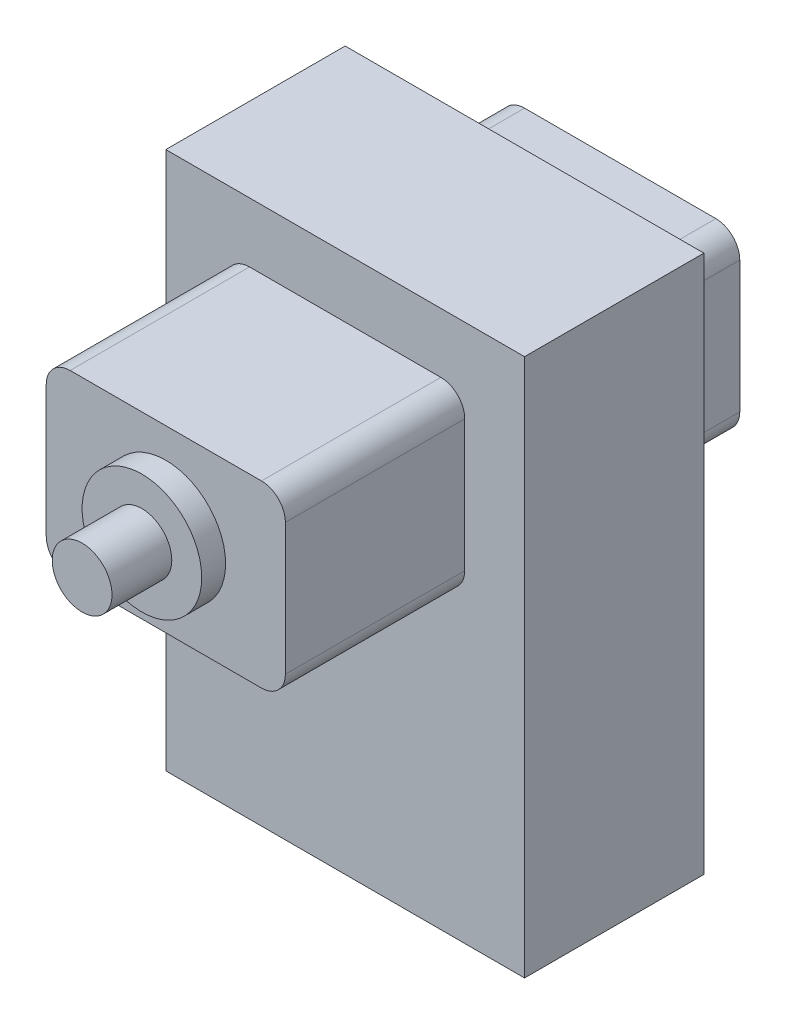
ISO-10303-21;
HEADER;
FILE_DESCRIPTION(('STEP AP214'),'2;1');
FILE_NAME('part.step','',(''),(''),'','','');
FILE_SCHEMA(('AUTOMOTIVE_DESIGN { 1 0 10303 214 1 1 1 1 }'));
ENDSEC;
DATA;
#1=APPLICATION_CONTEXT('core data for automotive mechanical design processes');
#2=APPLICATION_PROTOCOL_DEFINITION('international standard','automotive_design',2000,#1);
#3=PRODUCT_CONTEXT('',#1,'mechanical');
#4=PRODUCT('Part','Part','',(#3));
#5=PRODUCT_RELATED_PRODUCT_CATEGORY('part','',(#4));
#6=PRODUCT_DEFINITION_FORMATION('','',#4);
#7=PRODUCT_DEFINITION_CONTEXT('part definition',#1,'design');
#8=PRODUCT_DEFINITION('design','',#6,#7);
#9=PRODUCT_DEFINITION_SHAPE('','',#8);
#10=(LENGTH_UNIT() NAMED_UNIT(*) SI_UNIT(.MILLI.,.METRE.));
#11=(NAMED_UNIT(*) PLANE_ANGLE_UNIT() SI_UNIT($,.RADIAN.));
#12=(NAMED_UNIT(*) SI_UNIT($,.STERADIAN.) SOLID_ANGLE_UNIT());
#13=UNCERTAINTY_MEASURE_WITH_UNIT(LENGTH_MEASURE(1.E-05),#10,'distance_accuracy_value','');
#14=(GEOMETRIC_REPRESENTATION_CONTEXT(3) GLOBAL_UNCERTAINTY_ASSIGNED_CONTEXT((#13)) GLOBAL_UNIT_ASSIGNED_CONTEXT((#10,
#11,#12)) REPRESENTATION_CONTEXT('',''));
#15=CARTESIAN_POINT('',(0.,0.,0.));
#16=DIRECTION('',(0.,0.,1.));
#17=DIRECTION('',(1.,0.,0.));
#18=AXIS2_PLACEMENT_3D('',#15,#16,#17);
#19=CARTESIAN_POINT('',(0.,0.,0.));
#20=DIRECTION('',(0.,0.,1.));
#21=DIRECTION('',(1.,0.,0.));
#22=AXIS2_PLACEMENT_3D('',#19,#20,#21);
#23=PLANE('',#22);
#24=DIRECTION('',(0.,1.,0.));
#25=VECTOR('',#24,1.);
#26=CARTESIAN_POINT('',(0.,0.,0.));
#27=LINE('',#26,#25);
#28=CARTESIAN_POINT('',(0.,0.,0.));
#29=VERTEX_POINT('',#28);
#30=CARTESIAN_POINT('',(0.,45.,0.));
#31=VERTEX_POINT('',#30);
#32=EDGE_CURVE('E181',#29,#31,#27,.T.);
#33=ORIENTED_EDGE('',*,*,#32,.F.);
#34=DIRECTION('',(1.,0.,0.));
#35=VECTOR('',#34,1.);
#36=CARTESIAN_POINT('',(0.,0.,0.));
#37=LINE('',#36,#35);
#38=CARTESIAN_POINT('',(-30.,0.,0.));
#39=VERTEX_POINT('',#38);
#40=EDGE_CURVE('E177',#39,#29,#37,.T.);
#41=ORIENTED_EDGE('',*,*,#40,.F.);
#42=DIRECTION('',(0.,-1.,0.));
#43=VECTOR('',#42,1.);
#44=CARTESIAN_POINT('',(-30.,0.,0.));
#45=LINE('',#44,#43);
#46=CARTESIAN_POINT('',(-30.,45.,0.));
#47=VERTEX_POINT('',#46);
#48=EDGE_CURVE('E314',#47,#39,#45,.T.);
#49=ORIENTED_EDGE('',*,*,#48,.F.);
#50=DIRECTION('',(-1.,0.,0.));
#51=VECTOR('',#50,1.);
#52=CARTESIAN_POINT('',(0.,45.,0.));
#53=LINE('',#52,#51);
#54=EDGE_CURVE('E312',#31,#47,#53,.T.);
#55=ORIENTED_EDGE('',*,*,#54,.F.);
#56=EDGE_LOOP('',(#33,#41,#49,#55));
#57=FACE_BOUND('',#56,.T.);
#58=DIRECTION('',(0.,-1.,0.));
#59=VECTOR('',#58,1.);
#60=CARTESIAN_POINT('',(-5.,40.,0.));
#61=LINE('',#60,#59);
#62=CARTESIAN_POINT('',(-5.,38.,0.));
#63=VERTEX_POINT('',#62);
#64=CARTESIAN_POINT('',(-5.,27.,0.));
#65=VERTEX_POINT('',#64);
#66=EDGE_CURVE('E276',#63,#65,#61,.T.);
#67=ORIENTED_EDGE('',*,*,#66,.F.);
#68=CARTESIAN_POINT('',(-7.,38.,0.));
#69=DIRECTION('',(0.,0.,1.));
#70=DIRECTION('',(1.,0.,0.));
#71=AXIS2_PLACEMENT_3D('',#68,#69,#70);
#72=CIRCLE('',#71,2.);
#73=CARTESIAN_POINT('',(-7.,40.,0.));
#74=VERTEX_POINT('',#73);
#75=EDGE_CURVE('E21',#63,#74,#72,.T.);
#76=ORIENTED_EDGE('',*,*,#75,.T.);
#77=DIRECTION('',(1.,0.,0.));
#78=VECTOR('',#77,1.);
#79=CARTESIAN_POINT('',(-5.,40.,0.));
#80=LINE('',#79,#78);
#81=CARTESIAN_POINT('',(-23.,40.,0.));
#82=VERTEX_POINT('',#81);
#83=EDGE_CURVE('E266',#82,#74,#80,.T.);
#84=ORIENTED_EDGE('',*,*,#83,.F.);
#85=CARTESIAN_POINT('',(-23.,38.,0.));
#86=DIRECTION('',(0.,0.,1.));
#87=DIRECTION('',(1.,0.,0.));
#88=AXIS2_PLACEMENT_3D('',#85,#86,#87);
#89=CIRCLE('',#88,2.);
#90=CARTESIAN_POINT('',(-25.,38.,0.));
#91=VERTEX_POINT('',#90);
#92=EDGE_CURVE('E250',#82,#91,#89,.T.);
#93=ORIENTED_EDGE('',*,*,#92,.T.);
#94=DIRECTION('',(0.,1.,0.));
#95=VECTOR('',#94,1.);
#96=CARTESIAN_POINT('',(-25.,40.,0.));
#97=LINE('',#96,#95);
#98=CARTESIAN_POINT('',(-25.,27.,0.));
#99=VERTEX_POINT('',#98);
#100=EDGE_CURVE('E281',#99,#91,#97,.T.);
#101=ORIENTED_EDGE('',*,*,#100,.F.);
#102=CARTESIAN_POINT('',(-23.,27.,0.));
#103=DIRECTION('',(0.,0.,1.));
#104=DIRECTION('',(1.,0.,0.));
#105=AXIS2_PLACEMENT_3D('',#102,#103,#104);
#106=CIRCLE('',#105,2.);
#107=CARTESIAN_POINT('',(-23.,25.,0.));
#108=VERTEX_POINT('',#107);
#109=EDGE_CURVE('E252',#99,#108,#106,.T.);
#110=ORIENTED_EDGE('',*,*,#109,.T.);
#111=DIRECTION('',(-1.,0.,0.));
#112=VECTOR('',#111,1.);
#113=CARTESIAN_POINT('',(-5.,25.,0.));
#114=LINE('',#113,#112);
#115=CARTESIAN_POINT('',(-7.,25.,0.));
#116=VERTEX_POINT('',#115);
#117=EDGE_CURVE('E278',#116,#108,#114,.T.);
#118=ORIENTED_EDGE('',*,*,#117,.F.);
#119=CARTESIAN_POINT('',(-7.,27.,0.));
#120=DIRECTION('',(0.,0.,1.));
#121=DIRECTION('',(1.,0.,0.));
#122=AXIS2_PLACEMENT_3D('',#119,#120,#121);
#123=CIRCLE('',#122,2.);
#124=EDGE_CURVE('E34',#116,#65,#123,.T.);
#125=ORIENTED_EDGE('',*,*,#124,.T.);
#126=EDGE_LOOP('',(#67,#76,#84,#93,#101,#110,#118,#125));
#127=FACE_BOUND('',#126,.T.);
#128=ADVANCED_FACE('F17',(#57,#127),#23,.F.);
#129=CARTESIAN_POINT('',(0.,0.,15.));
#130=DIRECTION('',(-1.,0.,0.));
#131=DIRECTION('',(0.,0.,1.));
#132=AXIS2_PLACEMENT_3D('',#129,#130,#131);
#133=PLANE('',#132);
#134=ORIENTED_EDGE('',*,*,#32,.T.);
#135=DIRECTION('',(0.,0.,-1.));
#136=VECTOR('',#135,1.);
#137=CARTESIAN_POINT('',(0.,45.,15.));
#138=LINE('',#137,#136);
#139=CARTESIAN_POINT('',(0.,45.,15.));
#140=VERTEX_POINT('',#139);
#141=EDGE_CURVE('E161',#140,#31,#138,.T.);
#142=ORIENTED_EDGE('',*,*,#141,.F.);
#143=DIRECTION('',(0.,1.,0.));
#144=VECTOR('',#143,1.);
#145=CARTESIAN_POINT('',(0.,0.,15.));
#146=LINE('',#145,#144);
#147=CARTESIAN_POINT('',(0.,0.,15.));
#148=VERTEX_POINT('',#147);
#149=EDGE_CURVE('E168',#148,#140,#146,.T.);
#150=ORIENTED_EDGE('',*,*,#149,.F.);
#151=DIRECTION('',(0.,0.,-1.));
#152=VECTOR('',#151,1.);
#153=CARTESIAN_POINT('',(0.,0.,15.));
#154=LINE('',#153,#152);
#155=EDGE_CURVE('E310',#148,#29,#154,.T.);
#156=ORIENTED_EDGE('',*,*,#155,.T.);
#157=EDGE_LOOP('',(#134,#142,#150,#156));
#158=FACE_BOUND('',#157,.T.);
#159=ADVANCED_FACE('F179',(#158),#133,.F.);
#160=CARTESIAN_POINT('',(0.,45.,15.));
#161=DIRECTION('',(0.,-1.,0.));
#162=DIRECTION('',(0.,0.,-1.));
#163=AXIS2_PLACEMENT_3D('',#160,#161,#162);
#164=PLANE('',#163);
#165=ORIENTED_EDGE('',*,*,#54,.T.);
#166=DIRECTION('',(0.,0.,-1.));
#167=VECTOR('',#166,1.);
#168=CARTESIAN_POINT('',(-30.,45.,15.));
#169=LINE('',#168,#167);
#170=CARTESIAN_POINT('',(-30.,45.,15.));
#171=VERTEX_POINT('',#170);
#172=EDGE_CURVE('E164',#171,#47,#169,.T.);
#173=ORIENTED_EDGE('',*,*,#172,.F.);
#174=DIRECTION('',(-1.,0.,0.));
#175=VECTOR('',#174,1.);
#176=CARTESIAN_POINT('',(0.,45.,15.));
#177=LINE('',#176,#175);
#178=EDGE_CURVE('E157',#140,#171,#177,.T.);
#179=ORIENTED_EDGE('',*,*,#178,.F.);
#180=ORIENTED_EDGE('',*,*,#141,.T.);
#181=EDGE_LOOP('',(#165,#173,#179,#180));
#182=FACE_BOUND('',#181,.T.);
#183=ADVANCED_FACE('F159',(#182),#164,.F.);
#184=CARTESIAN_POINT('',(-30.,0.,15.));
#185=DIRECTION('',(1.,0.,0.));
#186=DIRECTION('',(0.,0.,-1.));
#187=AXIS2_PLACEMENT_3D('',#184,#185,#186);
#188=PLANE('',#187);
#189=ORIENTED_EDGE('',*,*,#48,.T.);
#190=DIRECTION('',(0.,0.,-1.));
#191=VECTOR('',#190,1.);
#192=CARTESIAN_POINT('',(-30.,0.,15.));
#193=LINE('',#192,#191);
#194=CARTESIAN_POINT('',(-30.,0.,15.));
#195=VERTEX_POINT('',#194);
#196=EDGE_CURVE('E186',#195,#39,#193,.T.);
#197=ORIENTED_EDGE('',*,*,#196,.F.);
#198=DIRECTION('',(0.,-1.,0.));
#199=VECTOR('',#198,1.);
#200=CARTESIAN_POINT('',(-30.,0.,15.));
#201=LINE('',#200,#199);
#202=EDGE_CURVE('E167',#171,#195,#201,.T.);
#203=ORIENTED_EDGE('',*,*,#202,.F.);
#204=ORIENTED_EDGE('',*,*,#172,.T.);
#205=EDGE_LOOP('',(#189,#197,#203,#204));
#206=FACE_BOUND('',#205,.T.);
#207=ADVANCED_FACE('F325',(#206),#188,.F.);
#208=CARTESIAN_POINT('',(0.,0.,15.));
#209=DIRECTION('',(0.,1.,0.));
#210=DIRECTION('',(-1.,0.,0.));
#211=AXIS2_PLACEMENT_3D('',#208,#209,#210);
#212=PLANE('',#211);
#213=ORIENTED_EDGE('',*,*,#40,.T.);
#214=ORIENTED_EDGE('',*,*,#155,.F.);
#215=DIRECTION('',(1.,0.,0.));
#216=VECTOR('',#215,1.);
#217=CARTESIAN_POINT('',(0.,0.,15.));
#218=LINE('',#217,#216);
#219=EDGE_CURVE('E173',#195,#148,#218,.T.);
#220=ORIENTED_EDGE('',*,*,#219,.F.);
#221=ORIENTED_EDGE('',*,*,#196,.T.);
#222=EDGE_LOOP('',(#213,#214,#220,#221));
#223=FACE_BOUND('',#222,.T.);
#224=ADVANCED_FACE('F321',(#223),#212,.F.);
#225=CARTESIAN_POINT('',(0.,0.,15.));
#226=DIRECTION('',(0.,0.,1.));
#227=DIRECTION('',(1.,0.,0.));
#228=AXIS2_PLACEMENT_3D('',#225,#226,#227);
#229=PLANE('',#228);
#230=DIRECTION('',(0.,-1.,0.));
#231=VECTOR('',#230,1.);
#232=CARTESIAN_POINT('',(-25.,40.,15.));
#233=LINE('',#232,#231);
#234=CARTESIAN_POINT('',(-25.,38.,15.));
#235=VERTEX_POINT('',#234);
#236=CARTESIAN_POINT('',(-25.,27.,15.));
#237=VERTEX_POINT('',#236);
#238=EDGE_CURVE('E275',#235,#237,#233,.T.);
#239=ORIENTED_EDGE('',*,*,#238,.F.);
#240=CARTESIAN_POINT('',(-23.,38.,15.));
#241=DIRECTION('',(0.,0.,1.));
#242=DIRECTION('',(1.,0.,0.));
#243=AXIS2_PLACEMENT_3D('',#240,#241,#242);
#244=CIRCLE('',#243,2.);
#245=CARTESIAN_POINT('',(-23.,40.,15.));
#246=VERTEX_POINT('',#245);
#247=EDGE_CURVE('E248',#235,#246,#244,.F.);
#248=ORIENTED_EDGE('',*,*,#247,.T.);
#249=DIRECTION('',(-1.,0.,0.));
#250=VECTOR('',#249,1.);
#251=CARTESIAN_POINT('',(-25.,40.,15.));
#252=LINE('',#251,#250);
#253=CARTESIAN_POINT('',(-7.,40.,15.));
#254=VERTEX_POINT('',#253);
#255=EDGE_CURVE('E289',#254,#246,#252,.T.);
#256=ORIENTED_EDGE('',*,*,#255,.F.);
#257=CARTESIAN_POINT('',(-7.,38.,15.));
#258=DIRECTION('',(0.,0.,1.));
#259=DIRECTION('',(1.,0.,0.));
#260=AXIS2_PLACEMENT_3D('',#257,#258,#259);
#261=CIRCLE('',#260,2.);
#262=CARTESIAN_POINT('',(-5.,38.,15.));
#263=VERTEX_POINT('',#262);
#264=EDGE_CURVE('E246',#254,#263,#261,.F.);
#265=ORIENTED_EDGE('',*,*,#264,.T.);
#266=DIRECTION('',(0.,1.,0.));
#267=VECTOR('',#266,1.);
#268=CARTESIAN_POINT('',(-5.,40.,15.));
#269=LINE('',#268,#267);
#270=CARTESIAN_POINT('',(-5.,27.,15.));
#271=VERTEX_POINT('',#270);
#272=EDGE_CURVE('E303',#271,#263,#269,.T.);
#273=ORIENTED_EDGE('',*,*,#272,.F.);
#274=CARTESIAN_POINT('',(-7.,27.,15.));
#275=DIRECTION('',(0.,0.,1.));
#276=DIRECTION('',(1.,0.,0.));
#277=AXIS2_PLACEMENT_3D('',#274,#275,#276);
#278=CIRCLE('',#277,2.);
#279=CARTESIAN_POINT('',(-7.,25.,15.));
#280=VERTEX_POINT('',#279);
#281=EDGE_CURVE('E244',#271,#280,#278,.F.);
#282=ORIENTED_EDGE('',*,*,#281,.T.);
#283=DIRECTION('',(1.,0.,0.));
#284=VECTOR('',#283,1.);
#285=CARTESIAN_POINT('',(-25.,25.,15.));
#286=LINE('',#285,#284);
#287=CARTESIAN_POINT('',(-23.,25.,15.));
#288=VERTEX_POINT('',#287);
#289=EDGE_CURVE('E300',#288,#280,#286,.T.);
#290=ORIENTED_EDGE('',*,*,#289,.F.);
#291=CARTESIAN_POINT('',(-23.,27.,15.));
#292=DIRECTION('',(0.,0.,1.));
#293=DIRECTION('',(1.,0.,0.));
#294=AXIS2_PLACEMENT_3D('',#291,#292,#293);
#295=CIRCLE('',#294,2.);
#296=EDGE_CURVE('E242',#288,#237,#295,.F.);
#297=ORIENTED_EDGE('',*,*,#296,.T.);
#298=EDGE_LOOP('',(#239,#248,#256,#265,#273,#282,#290,#297));
#299=FACE_BOUND('',#298,.T.);
#300=ORIENTED_EDGE('',*,*,#149,.T.);
#301=ORIENTED_EDGE('',*,*,#178,.T.);
#302=ORIENTED_EDGE('',*,*,#202,.T.);
#303=ORIENTED_EDGE('',*,*,#219,.T.);
#304=EDGE_LOOP('',(#300,#301,#302,#303));
#305=FACE_BOUND('',#304,.T.);
#306=ADVANCED_FACE('F171',(#299,#305),#229,.T.);
#307=CARTESIAN_POINT('',(-25.,40.,30.));
#308=DIRECTION('',(1.,0.,0.));
#309=DIRECTION('',(0.,0.,-1.));
#310=AXIS2_PLACEMENT_3D('',#307,#308,#309);
#311=PLANE('',#310);
#312=ORIENTED_EDGE('',*,*,#238,.T.);
#313=DIRECTION('',(0.,0.,-1.));
#314=VECTOR('',#313,1.);
#315=CARTESIAN_POINT('',(-25.,27.,30.));
#316=LINE('',#315,#314);
#317=CARTESIAN_POINT('',(-25.,27.,30.));
#318=VERTEX_POINT('',#317);
#319=EDGE_CURVE('E195',#237,#318,#316,.F.);
#320=ORIENTED_EDGE('',*,*,#319,.T.);
#321=DIRECTION('',(0.,-1.,0.));
#322=VECTOR('',#321,1.);
#323=CARTESIAN_POINT('',(-25.,40.,30.));
#324=LINE('',#323,#322);
#325=CARTESIAN_POINT('',(-25.,38.,30.));
#326=VERTEX_POINT('',#325);
#327=EDGE_CURVE('E285',#326,#318,#324,.T.);
#328=ORIENTED_EDGE('',*,*,#327,.F.);
#329=DIRECTION('',(0.,0.,-1.));
#330=VECTOR('',#329,1.);
#331=CARTESIAN_POINT('',(-25.,38.,30.));
#332=LINE('',#331,#330);
#333=EDGE_CURVE('E192',#326,#235,#332,.T.);
#334=ORIENTED_EDGE('',*,*,#333,.T.);
#335=EDGE_LOOP('',(#312,#320,#328,#334));
#336=FACE_BOUND('',#335,.T.);
#337=ADVANCED_FACE('F345',(#336),#311,.F.);
#338=CARTESIAN_POINT('',(-25.,25.,30.));
#339=DIRECTION('',(0.,1.,0.));
#340=DIRECTION('',(0.,0.,1.));
#341=AXIS2_PLACEMENT_3D('',#338,#339,#340);
#342=PLANE('',#341);
#343=DIRECTION('',(1.,0.,0.));
#344=VECTOR('',#343,1.);
#345=CARTESIAN_POINT('',(-25.,25.,30.));
#346=LINE('',#345,#344);
#347=CARTESIAN_POINT('',(-23.,25.,30.));
#348=VERTEX_POINT('',#347);
#349=CARTESIAN_POINT('',(-7.,25.,30.));
#350=VERTEX_POINT('',#349);
#351=EDGE_CURVE('E288',#348,#350,#346,.T.);
#352=ORIENTED_EDGE('',*,*,#351,.F.);
#353=DIRECTION('',(0.,0.,-1.));
#354=VECTOR('',#353,1.);
#355=CARTESIAN_POINT('',(-23.,25.,30.));
#356=LINE('',#355,#354);
#357=EDGE_CURVE('E184',#348,#288,#356,.T.);
#358=ORIENTED_EDGE('',*,*,#357,.T.);
#359=ORIENTED_EDGE('',*,*,#289,.T.);
#360=DIRECTION('',(0.,0.,-1.));
#361=VECTOR('',#360,1.);
#362=CARTESIAN_POINT('',(-7.,25.,30.));
#363=LINE('',#362,#361);
#364=EDGE_CURVE('E182',#280,#350,#363,.F.);
#365=ORIENTED_EDGE('',*,*,#364,.T.);
#366=EDGE_LOOP('',(#352,#358,#359,#365));
#367=FACE_BOUND('',#366,.T.);
#368=ADVANCED_FACE('F349',(#367),#342,.F.);
#369=CARTESIAN_POINT('',(-5.,40.,30.));
#370=DIRECTION('',(-1.,0.,0.));
#371=DIRECTION('',(0.,0.,1.));
#372=AXIS2_PLACEMENT_3D('',#369,#370,#371);
#373=PLANE('',#372);
#374=DIRECTION('',(0.,1.,0.));
#375=VECTOR('',#374,1.);
#376=CARTESIAN_POINT('',(-5.,40.,30.));
#377=LINE('',#376,#375);
#378=CARTESIAN_POINT('',(-5.,27.,30.));
#379=VERTEX_POINT('',#378);
#380=CARTESIAN_POINT('',(-5.,38.,30.));
#381=VERTEX_POINT('',#380);
#382=EDGE_CURVE('E292',#379,#381,#377,.T.);
#383=ORIENTED_EDGE('',*,*,#382,.F.);
#384=DIRECTION('',(0.,0.,-1.));
#385=VECTOR('',#384,1.);
#386=CARTESIAN_POINT('',(-5.,27.,30.));
#387=LINE('',#386,#385);
#388=EDGE_CURVE('E207',#379,#271,#387,.T.);
#389=ORIENTED_EDGE('',*,*,#388,.T.);
#390=ORIENTED_EDGE('',*,*,#272,.T.);
#391=DIRECTION('',(0.,0.,-1.));
#392=VECTOR('',#391,1.);
#393=CARTESIAN_POINT('',(-5.,38.,30.));
#394=LINE('',#393,#392);
#395=EDGE_CURVE('E205',#263,#381,#394,.F.);
#396=ORIENTED_EDGE('',*,*,#395,.T.);
#397=EDGE_LOOP('',(#383,#389,#390,#396));
#398=FACE_BOUND('',#397,.T.);
#399=ADVANCED_FACE('F353',(#398),#373,.F.);
#400=CARTESIAN_POINT('',(-25.,40.,30.));
#401=DIRECTION('',(0.,-1.,0.));
#402=DIRECTION('',(0.,0.,-1.));
#403=AXIS2_PLACEMENT_3D('',#400,#401,#402);
#404=PLANE('',#403);
#405=DIRECTION('',(-1.,0.,0.));
#406=VECTOR('',#405,1.);
#407=CARTESIAN_POINT('',(-25.,40.,30.));
#408=LINE('',#407,#406);
#409=CARTESIAN_POINT('',(-7.,40.,30.));
#410=VERTEX_POINT('',#409);
#411=CARTESIAN_POINT('',(-23.,40.,30.));
#412=VERTEX_POINT('',#411);
#413=EDGE_CURVE('E295',#410,#412,#408,.T.);
#414=ORIENTED_EDGE('',*,*,#413,.F.);
#415=DIRECTION('',(0.,0.,-1.));
#416=VECTOR('',#415,1.);
#417=CARTESIAN_POINT('',(-7.,40.,30.));
#418=LINE('',#417,#416);
#419=EDGE_CURVE('E212',#410,#254,#418,.T.);
#420=ORIENTED_EDGE('',*,*,#419,.T.);
#421=ORIENTED_EDGE('',*,*,#255,.T.);
#422=DIRECTION('',(0.,0.,-1.));
#423=VECTOR('',#422,1.);
#424=CARTESIAN_POINT('',(-23.,40.,30.));
#425=LINE('',#424,#423);
#426=EDGE_CURVE('E210',#246,#412,#425,.F.);
#427=ORIENTED_EDGE('',*,*,#426,.T.);
#428=EDGE_LOOP('',(#414,#420,#421,#427));
#429=FACE_BOUND('',#428,.T.);
#430=ADVANCED_FACE('F357',(#429),#404,.F.);
#431=CARTESIAN_POINT('',(0.,0.,30.));
#432=DIRECTION('',(0.,0.,1.));
#433=DIRECTION('',(1.,0.,0.));
#434=AXIS2_PLACEMENT_3D('',#431,#432,#433);
#435=PLANE('',#434);
#436=CARTESIAN_POINT('',(-15.,32.5,30.));
#437=DIRECTION('',(0.,0.,1.));
#438=DIRECTION('',(1.,0.,0.));
#439=AXIS2_PLACEMENT_3D('',#436,#437,#438);
#440=CIRCLE('',#439,5.);
#441=CARTESIAN_POINT('',(-10.,32.5,30.));
#442=VERTEX_POINT('',#441);
#443=EDGE_CURVE('E26',#442,#442,#440,.T.);
#444=ORIENTED_EDGE('',*,*,#443,.F.);
#445=EDGE_LOOP('',(#444));
#446=FACE_BOUND('',#445,.T.);
#447=ORIENTED_EDGE('',*,*,#327,.T.);
#448=CARTESIAN_POINT('',(-23.,27.,30.));
#449=DIRECTION('',(0.,0.,1.));
#450=DIRECTION('',(1.,0.,0.));
#451=AXIS2_PLACEMENT_3D('',#448,#449,#450);
#452=CIRCLE('',#451,2.);
#453=EDGE_CURVE('E203',#318,#348,#452,.T.);
#454=ORIENTED_EDGE('',*,*,#453,.T.);
#455=ORIENTED_EDGE('',*,*,#351,.T.);
#456=CARTESIAN_POINT('',(-7.,27.,30.));
#457=DIRECTION('',(0.,0.,1.));
#458=DIRECTION('',(1.,0.,0.));
#459=AXIS2_PLACEMENT_3D('',#456,#457,#458);
#460=CIRCLE('',#459,2.);
#461=EDGE_CURVE('E201',#350,#379,#460,.T.);
#462=ORIENTED_EDGE('',*,*,#461,.T.);
#463=ORIENTED_EDGE('',*,*,#382,.T.);
#464=CARTESIAN_POINT('',(-7.,38.,30.));
#465=DIRECTION('',(0.,0.,1.));
#466=DIRECTION('',(1.,0.,0.));
#467=AXIS2_PLACEMENT_3D('',#464,#465,#466);
#468=CIRCLE('',#467,2.);
#469=EDGE_CURVE('E199',#381,#410,#468,.T.);
#470=ORIENTED_EDGE('',*,*,#469,.T.);
#471=ORIENTED_EDGE('',*,*,#413,.T.);
#472=CARTESIAN_POINT('',(-23.,38.,30.));
#473=DIRECTION('',(0.,0.,1.));
#474=DIRECTION('',(1.,0.,0.));
#475=AXIS2_PLACEMENT_3D('',#472,#473,#474);
#476=CIRCLE('',#475,2.);
#477=EDGE_CURVE('E197',#412,#326,#476,.T.);
#478=ORIENTED_EDGE('',*,*,#477,.T.);
#479=EDGE_LOOP('',(#447,#454,#455,#462,#463,#470,#471,#478));
#480=FACE_BOUND('',#479,.T.);
#481=ADVANCED_FACE('F361',(#446,#480),#435,.T.);
#482=CARTESIAN_POINT('',(-5.,40.,-8.));
#483=DIRECTION('',(-1.,0.,0.));
#484=DIRECTION('',(0.,-1.,0.));
#485=AXIS2_PLACEMENT_3D('',#482,#483,#484);
#486=PLANE('',#485);
#487=ORIENTED_EDGE('',*,*,#66,.T.);
#488=DIRECTION('',(0.,0.,1.));
#489=VECTOR('',#488,1.);
#490=CARTESIAN_POINT('',(-5.,27.,-8.));
#491=LINE('',#490,#489);
#492=CARTESIAN_POINT('',(-5.,27.,-8.));
#493=VERTEX_POINT('',#492);
#494=EDGE_CURVE('E240',#65,#493,#491,.F.);
#495=ORIENTED_EDGE('',*,*,#494,.T.);
#496=DIRECTION('',(0.,-1.,0.));
#497=VECTOR('',#496,1.);
#498=CARTESIAN_POINT('',(-5.,40.,-8.));
#499=LINE('',#498,#497);
#500=CARTESIAN_POINT('',(-5.,38.,-8.));
#501=VERTEX_POINT('',#500);
#502=EDGE_CURVE('E262',#501,#493,#499,.T.);
#503=ORIENTED_EDGE('',*,*,#502,.F.);
#504=DIRECTION('',(0.,0.,1.));
#505=VECTOR('',#504,1.);
#506=CARTESIAN_POINT('',(-5.,38.,-8.));
#507=LINE('',#506,#505);
#508=EDGE_CURVE('E238',#501,#63,#507,.T.);
#509=ORIENTED_EDGE('',*,*,#508,.T.);
#510=EDGE_LOOP('',(#487,#495,#503,#509));
#511=FACE_BOUND('',#510,.T.);
#512=ADVANCED_FACE('F365',(#511),#486,.F.);
#513=CARTESIAN_POINT('',(-5.,25.,-8.));
#514=DIRECTION('',(0.,1.,0.));
#515=DIRECTION('',(0.,0.,1.));
#516=AXIS2_PLACEMENT_3D('',#513,#514,#515);
#517=PLANE('',#516);
#518=ORIENTED_EDGE('',*,*,#117,.T.);
#519=DIRECTION('',(0.,0.,1.));
#520=VECTOR('',#519,1.);
#521=CARTESIAN_POINT('',(-23.,25.,-8.));
#522=LINE('',#521,#520);
#523=CARTESIAN_POINT('',(-23.,25.,-8.));
#524=VERTEX_POINT('',#523);
#525=EDGE_CURVE('E236',#108,#524,#522,.F.);
#526=ORIENTED_EDGE('',*,*,#525,.T.);
#527=DIRECTION('',(-1.,0.,0.));
#528=VECTOR('',#527,1.);
#529=CARTESIAN_POINT('',(-5.,25.,-8.));
#530=LINE('',#529,#528);
#531=CARTESIAN_POINT('',(-7.,25.,-8.));
#532=VERTEX_POINT('',#531);
#533=EDGE_CURVE('E265',#532,#524,#530,.T.);
#534=ORIENTED_EDGE('',*,*,#533,.F.);
#535=DIRECTION('',(0.,0.,1.));
#536=VECTOR('',#535,1.);
#537=CARTESIAN_POINT('',(-7.,25.,-8.));
#538=LINE('',#537,#536);
#539=EDGE_CURVE('E233',#532,#116,#538,.T.);
#540=ORIENTED_EDGE('',*,*,#539,.T.);
#541=EDGE_LOOP('',(#518,#526,#534,#540));
#542=FACE_BOUND('',#541,.T.);
#543=ADVANCED_FACE('F369',(#542),#517,.F.);
#544=CARTESIAN_POINT('',(-25.,40.,-8.));
#545=DIRECTION('',(1.,0.,0.));
#546=DIRECTION('',(0.,1.,0.));
#547=AXIS2_PLACEMENT_3D('',#544,#545,#546);
#548=PLANE('',#547);
#549=ORIENTED_EDGE('',*,*,#100,.T.);
#550=DIRECTION('',(0.,0.,1.));
#551=VECTOR('',#550,1.);
#552=CARTESIAN_POINT('',(-25.,38.,-8.));
#553=LINE('',#552,#551);
#554=CARTESIAN_POINT('',(-25.,38.,-8.));
#555=VERTEX_POINT('',#554);
#556=EDGE_CURVE('E223',#91,#555,#553,.F.);
#557=ORIENTED_EDGE('',*,*,#556,.T.);
#558=DIRECTION('',(0.,1.,0.));
#559=VECTOR('',#558,1.);
#560=CARTESIAN_POINT('',(-25.,40.,-8.));
#561=LINE('',#560,#559);
#562=CARTESIAN_POINT('',(-25.,27.,-8.));
#563=VERTEX_POINT('',#562);
#564=EDGE_CURVE('E269',#563,#555,#561,.T.);
#565=ORIENTED_EDGE('',*,*,#564,.F.);
#566=DIRECTION('',(0.,0.,1.));
#567=VECTOR('',#566,1.);
#568=CARTESIAN_POINT('',(-25.,27.,-8.));
#569=LINE('',#568,#567);
#570=EDGE_CURVE('E220',#563,#99,#569,.T.);
#571=ORIENTED_EDGE('',*,*,#570,.T.);
#572=EDGE_LOOP('',(#549,#557,#565,#571));
#573=FACE_BOUND('',#572,.T.);
#574=ADVANCED_FACE('F373',(#573),#548,.F.);
#575=CARTESIAN_POINT('',(-5.,40.,-8.));
#576=DIRECTION('',(0.,-1.,0.));
#577=DIRECTION('',(0.,0.,-1.));
#578=AXIS2_PLACEMENT_3D('',#575,#576,#577);
#579=PLANE('',#578);
#580=DIRECTION('',(1.,0.,0.));
#581=VECTOR('',#580,1.);
#582=CARTESIAN_POINT('',(-5.,40.,-8.));
#583=LINE('',#582,#581);
#584=CARTESIAN_POINT('',(-23.,40.,-8.));
#585=VERTEX_POINT('',#584);
#586=CARTESIAN_POINT('',(-7.,40.,-8.));
#587=VERTEX_POINT('',#586);
#588=EDGE_CURVE('E272',#585,#587,#583,.T.);
#589=ORIENTED_EDGE('',*,*,#588,.F.);
#590=DIRECTION('',(0.,0.,1.));
#591=VECTOR('',#590,1.);
#592=CARTESIAN_POINT('',(-23.,40.,-8.));
#593=LINE('',#592,#591);
#594=EDGE_CURVE('E217',#585,#82,#593,.T.);
#595=ORIENTED_EDGE('',*,*,#594,.T.);
#596=ORIENTED_EDGE('',*,*,#83,.T.);
#597=DIRECTION('',(0.,0.,1.));
#598=VECTOR('',#597,1.);
#599=CARTESIAN_POINT('',(-7.,40.,-8.));
#600=LINE('',#599,#598);
#601=EDGE_CURVE('E215',#74,#587,#600,.F.);
#602=ORIENTED_EDGE('',*,*,#601,.T.);
#603=EDGE_LOOP('',(#589,#595,#596,#602));
#604=FACE_BOUND('',#603,.T.);
#605=ADVANCED_FACE('F377',(#604),#579,.F.);
#606=CARTESIAN_POINT('',(0.,0.,-8.));
#607=DIRECTION('',(0.,0.,-1.));
#608=DIRECTION('',(-1.,0.,0.));
#609=AXIS2_PLACEMENT_3D('',#606,#607,#608);
#610=PLANE('',#609);
#611=ORIENTED_EDGE('',*,*,#564,.T.);
#612=CARTESIAN_POINT('',(-23.,38.,-8.));
#613=DIRECTION('',(0.,0.,-1.));
#614=DIRECTION('',(-1.,0.,0.));
#615=AXIS2_PLACEMENT_3D('',#612,#613,#614);
#616=CIRCLE('',#615,2.);
#617=EDGE_CURVE('E231',#555,#585,#616,.T.);
#618=ORIENTED_EDGE('',*,*,#617,.T.);
#619=ORIENTED_EDGE('',*,*,#588,.T.);
#620=CARTESIAN_POINT('',(-7.,38.,-8.));
#621=DIRECTION('',(0.,0.,-1.));
#622=DIRECTION('',(-1.,0.,0.));
#623=AXIS2_PLACEMENT_3D('',#620,#621,#622);
#624=CIRCLE('',#623,2.);
#625=EDGE_CURVE('E225',#587,#501,#624,.T.);
#626=ORIENTED_EDGE('',*,*,#625,.T.);
#627=ORIENTED_EDGE('',*,*,#502,.T.);
#628=CARTESIAN_POINT('',(-7.,27.,-8.));
#629=DIRECTION('',(0.,0.,-1.));
#630=DIRECTION('',(-1.,0.,0.));
#631=AXIS2_PLACEMENT_3D('',#628,#629,#630);
#632=CIRCLE('',#631,2.);
#633=EDGE_CURVE('E227',#493,#532,#632,.T.);
#634=ORIENTED_EDGE('',*,*,#633,.T.);
#635=ORIENTED_EDGE('',*,*,#533,.T.);
#636=CARTESIAN_POINT('',(-23.,27.,-8.));
#637=DIRECTION('',(0.,0.,-1.));
#638=DIRECTION('',(-1.,0.,0.));
#639=AXIS2_PLACEMENT_3D('',#636,#637,#638);
#640=CIRCLE('',#639,2.);
#641=EDGE_CURVE('E229',#524,#563,#640,.T.);
#642=ORIENTED_EDGE('',*,*,#641,.T.);
#643=EDGE_LOOP('',(#611,#618,#619,#626,#627,#634,#635,#642));
#644=FACE_BOUND('',#643,.T.);
#645=ADVANCED_FACE('F381',(#644),#610,.T.);
#646=CARTESIAN_POINT('',(-23.,27.,30.));
#647=DIRECTION('',(0.,0.,-1.));
#648=DIRECTION('',(-1.,0.,0.));
#649=AXIS2_PLACEMENT_3D('',#646,#647,#648);
#650=CYLINDRICAL_SURFACE('',#649,2.);
#651=ORIENTED_EDGE('',*,*,#453,.F.);
#652=ORIENTED_EDGE('',*,*,#319,.F.);
#653=ORIENTED_EDGE('',*,*,#296,.F.);
#654=ORIENTED_EDGE('',*,*,#357,.F.);
#655=EDGE_LOOP('',(#651,#652,#653,#654));
#656=FACE_BOUND('',#655,.T.);
#657=ADVANCED_FACE('F385',(#656),#650,.T.);
#658=CARTESIAN_POINT('',(-7.,27.,30.));
#659=DIRECTION('',(0.,0.,-1.));
#660=DIRECTION('',(-1.,0.,0.));
#661=AXIS2_PLACEMENT_3D('',#658,#659,#660);
#662=CYLINDRICAL_SURFACE('',#661,2.);
#663=ORIENTED_EDGE('',*,*,#461,.F.);
#664=ORIENTED_EDGE('',*,*,#364,.F.);
#665=ORIENTED_EDGE('',*,*,#281,.F.);
#666=ORIENTED_EDGE('',*,*,#388,.F.);
#667=EDGE_LOOP('',(#663,#664,#665,#666));
#668=FACE_BOUND('',#667,.T.);
#669=ADVANCED_FACE('F482',(#668),#662,.T.);
#670=CARTESIAN_POINT('',(-7.,38.,30.));
#671=DIRECTION('',(0.,0.,-1.));
#672=DIRECTION('',(-1.,0.,0.));
#673=AXIS2_PLACEMENT_3D('',#670,#671,#672);
#674=CYLINDRICAL_SURFACE('',#673,2.);
#675=ORIENTED_EDGE('',*,*,#469,.F.);
#676=ORIENTED_EDGE('',*,*,#395,.F.);
#677=ORIENTED_EDGE('',*,*,#264,.F.);
#678=ORIENTED_EDGE('',*,*,#419,.F.);
#679=EDGE_LOOP('',(#675,#676,#677,#678));
#680=FACE_BOUND('',#679,.T.);
#681=ADVANCED_FACE('F473',(#680),#674,.T.);
#682=CARTESIAN_POINT('',(-23.,38.,30.));
#683=DIRECTION('',(0.,0.,-1.));
#684=DIRECTION('',(-1.,0.,0.));
#685=AXIS2_PLACEMENT_3D('',#682,#683,#684);
#686=CYLINDRICAL_SURFACE('',#685,2.);
#687=ORIENTED_EDGE('',*,*,#477,.F.);
#688=ORIENTED_EDGE('',*,*,#426,.F.);
#689=ORIENTED_EDGE('',*,*,#247,.F.);
#690=ORIENTED_EDGE('',*,*,#333,.F.);
#691=EDGE_LOOP('',(#687,#688,#689,#690));
#692=FACE_BOUND('',#691,.T.);
#693=ADVANCED_FACE('F464',(#692),#686,.T.);
#694=CARTESIAN_POINT('',(-23.,38.,-8.));
#695=DIRECTION('',(0.,0.,1.));
#696=DIRECTION('',(1.,0.,0.));
#697=AXIS2_PLACEMENT_3D('',#694,#695,#696);
#698=CYLINDRICAL_SURFACE('',#697,2.);
#699=ORIENTED_EDGE('',*,*,#617,.F.);
#700=ORIENTED_EDGE('',*,*,#556,.F.);
#701=ORIENTED_EDGE('',*,*,#92,.F.);
#702=ORIENTED_EDGE('',*,*,#594,.F.);
#703=EDGE_LOOP('',(#699,#700,#701,#702));
#704=FACE_BOUND('',#703,.T.);
#705=ADVANCED_FACE('F455',(#704),#698,.T.);
#706=CARTESIAN_POINT('',(-23.,27.,-8.));
#707=DIRECTION('',(0.,0.,1.));
#708=DIRECTION('',(1.,0.,0.));
#709=AXIS2_PLACEMENT_3D('',#706,#707,#708);
#710=CYLINDRICAL_SURFACE('',#709,2.);
#711=ORIENTED_EDGE('',*,*,#641,.F.);
#712=ORIENTED_EDGE('',*,*,#525,.F.);
#713=ORIENTED_EDGE('',*,*,#109,.F.);
#714=ORIENTED_EDGE('',*,*,#570,.F.);
#715=EDGE_LOOP('',(#711,#712,#713,#714));
#716=FACE_BOUND('',#715,.T.);
#717=ADVANCED_FACE('F447',(#716),#710,.T.);
#718=CARTESIAN_POINT('',(-7.,27.,-8.));
#719=DIRECTION('',(0.,0.,1.));
#720=DIRECTION('',(1.,0.,0.));
#721=AXIS2_PLACEMENT_3D('',#718,#719,#720);
#722=CYLINDRICAL_SURFACE('',#721,2.);
#723=ORIENTED_EDGE('',*,*,#633,.F.);
#724=ORIENTED_EDGE('',*,*,#494,.F.);
#725=ORIENTED_EDGE('',*,*,#124,.F.);
#726=ORIENTED_EDGE('',*,*,#539,.F.);
#727=EDGE_LOOP('',(#723,#724,#725,#726));
#728=FACE_BOUND('',#727,.T.);
#729=ADVANCED_FACE('F440',(#728),#722,.T.);
#730=CARTESIAN_POINT('',(-7.,38.,-8.));
#731=DIRECTION('',(0.,0.,1.));
#732=DIRECTION('',(1.,0.,0.));
#733=AXIS2_PLACEMENT_3D('',#730,#731,#732);
#734=CYLINDRICAL_SURFACE('',#733,2.);
#735=ORIENTED_EDGE('',*,*,#625,.F.);
#736=ORIENTED_EDGE('',*,*,#601,.F.);
#737=ORIENTED_EDGE('',*,*,#75,.F.);
#738=ORIENTED_EDGE('',*,*,#508,.F.);
#739=EDGE_LOOP('',(#735,#736,#737,#738));
#740=FACE_BOUND('',#739,.T.);
#741=ADVANCED_FACE('F19',(#740),#734,.T.);
#742=CARTESIAN_POINT('',(-15.,32.5,32.));
#743=DIRECTION('',(0.,0.,-1.));
#744=DIRECTION('',(-1.,0.,0.));
#745=AXIS2_PLACEMENT_3D('',#742,#743,#744);
#746=CYLINDRICAL_SURFACE('',#745,5.);
#747=CARTESIAN_POINT('',(-15.,32.5,32.));
#748=DIRECTION('',(0.,0.,1.));
#749=DIRECTION('',(1.,0.,0.));
#750=AXIS2_PLACEMENT_3D('',#747,#748,#749);
#751=CIRCLE('',#750,5.);
#752=CARTESIAN_POINT('',(-10.,32.5,32.));
#753=VERTEX_POINT('',#752);
#754=EDGE_CURVE('E261',#753,#753,#751,.T.);
#755=ORIENTED_EDGE('',*,*,#754,.F.);
#756=EDGE_LOOP('',(#755));
#757=FACE_BOUND('',#756,.T.);
#758=ORIENTED_EDGE('',*,*,#443,.T.);
#759=EDGE_LOOP('',(#758));
#760=FACE_BOUND('',#759,.T.);
#761=ADVANCED_FACE('F387',(#757,#760),#746,.T.);
#762=CARTESIAN_POINT('',(-15.,32.5,32.));
#763=DIRECTION('',(0.,0.,1.));
#764=DIRECTION('',(1.,0.,0.));
#765=AXIS2_PLACEMENT_3D('',#762,#763,#764);
#766=PLANE('',#765);
#767=CARTESIAN_POINT('',(-15.,32.5,32.));
#768=DIRECTION('',(0.,0.,1.));
#769=DIRECTION('',(1.,0.,0.));
#770=AXIS2_PLACEMENT_3D('',#767,#768,#769);
#771=CIRCLE('',#770,2.5);
#772=CARTESIAN_POINT('',(-12.5,32.5,32.));
#773=VERTEX_POINT('',#772);
#774=EDGE_CURVE('E11',#773,#773,#771,.T.);
#775=ORIENTED_EDGE('',*,*,#774,.F.);
#776=EDGE_LOOP('',(#775));
#777=FACE_BOUND('',#776,.T.);
#778=ORIENTED_EDGE('',*,*,#754,.T.);
#779=EDGE_LOOP('',(#778));
#780=FACE_BOUND('',#779,.T.);
#781=ADVANCED_FACE('F390',(#777,#780),#766,.T.);
#782=CARTESIAN_POINT('',(-15.,32.5,37.));
#783=DIRECTION('',(0.,0.,-1.));
#784=DIRECTION('',(-1.,0.,0.));
#785=AXIS2_PLACEMENT_3D('',#782,#783,#784);
#786=CYLINDRICAL_SURFACE('',#785,2.5);
#787=CARTESIAN_POINT('',(-15.,32.5,37.));
#788=DIRECTION('',(0.,0.,1.));
#789=DIRECTION('',(1.,0.,0.));
#790=AXIS2_PLACEMENT_3D('',#787,#788,#789);
#791=CIRCLE('',#790,2.5);
#792=CARTESIAN_POINT('',(-12.5,32.5,37.));
#793=VERTEX_POINT('',#792);
#794=EDGE_CURVE('E408',#793,#793,#791,.T.);
#795=ORIENTED_EDGE('',*,*,#794,.F.);
#796=EDGE_LOOP('',(#795));
#797=FACE_BOUND('',#796,.T.);
#798=ORIENTED_EDGE('',*,*,#774,.T.);
#799=EDGE_LOOP('',(#798));
#800=FACE_BOUND('',#799,.T.);
#801=ADVANCED_FACE('F394',(#797,#800),#786,.T.);
#802=CARTESIAN_POINT('',(-15.,32.5,37.));
#803=DIRECTION('',(0.,0.,1.));
#804=DIRECTION('',(1.,0.,0.));
#805=AXIS2_PLACEMENT_3D('',#802,#803,#804);
#806=PLANE('',#805);
#807=ORIENTED_EDGE('',*,*,#794,.T.);
#808=EDGE_LOOP('',(#807));
#809=FACE_BOUND('',#808,.T.);
#810=ADVANCED_FACE('F398',(#809),#806,.T.);
#811=CLOSED_SHELL('',(#128,#159,#183,#207,#224,#306,#337,#368,#399,#430,#481,#512,#543,#574,
#605,#645,#657,#669,#681,#693,#705,#717,#729,#741,#761,#781,#801,#810));
#812=MANIFOLD_SOLID_BREP('B1',#811);
#813=ADVANCED_BREP_SHAPE_REPRESENTATION('',(#18,#812),#14);
#814=SHAPE_DEFINITION_REPRESENTATION(#9,#813);
ENDSEC;
END-ISO-10303-21;
